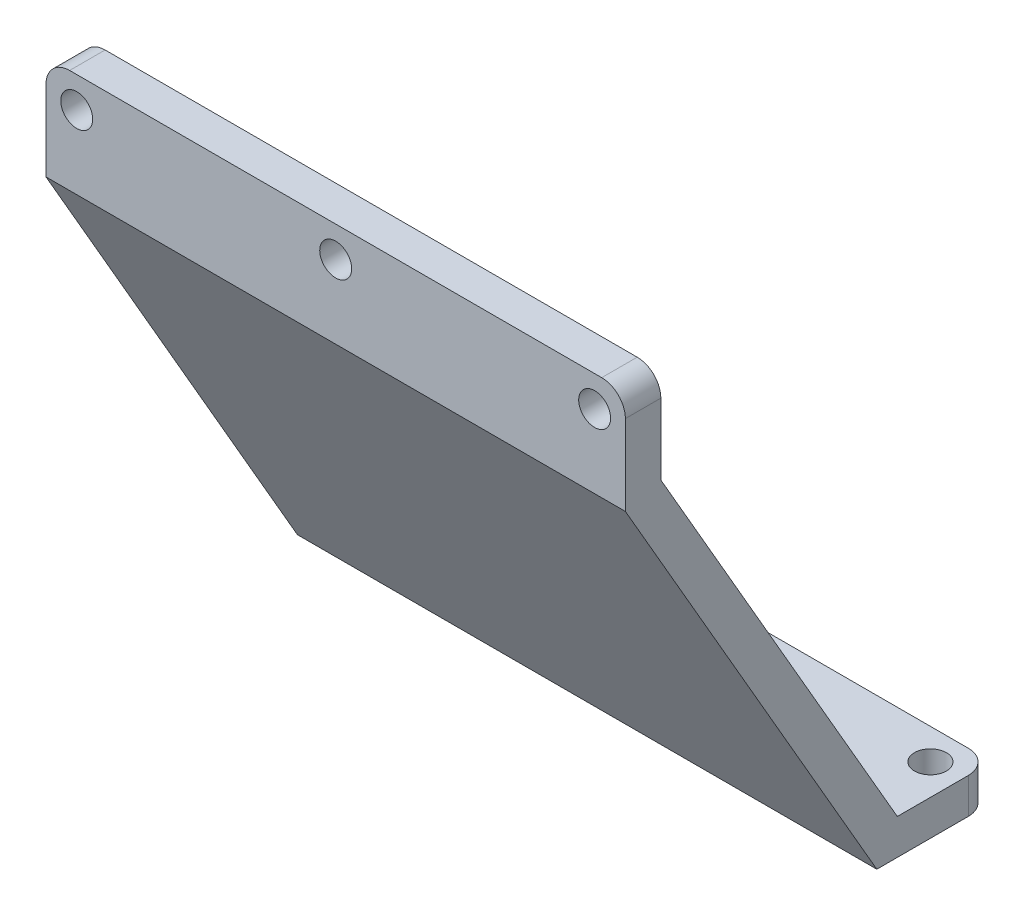
ISO-10303-21;
HEADER;
FILE_DESCRIPTION(('STEP AP214'),'2;1');
FILE_NAME('part.step','',(''),(''),'','','');
FILE_SCHEMA(('AUTOMOTIVE_DESIGN { 1 0 10303 214 1 1 1 1 }'));
ENDSEC;
DATA;
#1=APPLICATION_CONTEXT('core data for automotive mechanical design processes');
#2=APPLICATION_PROTOCOL_DEFINITION('international standard','automotive_design',2000,#1);
#3=PRODUCT_CONTEXT('',#1,'mechanical');
#4=PRODUCT('Part','Part','',(#3));
#5=PRODUCT_RELATED_PRODUCT_CATEGORY('part','',(#4));
#6=PRODUCT_DEFINITION_FORMATION('','',#4);
#7=PRODUCT_DEFINITION_CONTEXT('part definition',#1,'design');
#8=PRODUCT_DEFINITION('design','',#6,#7);
#9=PRODUCT_DEFINITION_SHAPE('','',#8);
#10=(LENGTH_UNIT() NAMED_UNIT(*) SI_UNIT(.MILLI.,.METRE.));
#11=(NAMED_UNIT(*) PLANE_ANGLE_UNIT() SI_UNIT($,.RADIAN.));
#12=(NAMED_UNIT(*) SI_UNIT($,.STERADIAN.) SOLID_ANGLE_UNIT());
#13=UNCERTAINTY_MEASURE_WITH_UNIT(LENGTH_MEASURE(1.E-05),#10,'distance_accuracy_value','');
#14=(GEOMETRIC_REPRESENTATION_CONTEXT(3) GLOBAL_UNCERTAINTY_ASSIGNED_CONTEXT((#13)) GLOBAL_UNIT_ASSIGNED_CONTEXT((#10,
#11,#12)) REPRESENTATION_CONTEXT('',''));
#15=CARTESIAN_POINT('',(0.,0.,0.));
#16=DIRECTION('',(0.,0.,1.));
#17=DIRECTION('',(1.,0.,0.));
#18=AXIS2_PLACEMENT_3D('',#15,#16,#17);
#19=CARTESIAN_POINT('',(24.5,22.82,31.));
#20=DIRECTION('',(-1.,0.,0.));
#21=DIRECTION('',(0.,-1.,0.));
#22=AXIS2_PLACEMENT_3D('',#19,#20,#21);
#23=PLANE('',#22);
#24=DIRECTION('',(0.,1.,0.));
#25=VECTOR('',#24,1.);
#26=CARTESIAN_POINT('',(24.5,22.82,28.));
#27=LINE('',#26,#25);
#28=CARTESIAN_POINT('',(24.5,14.82,28.));
#29=VERTEX_POINT('',#28);
#30=CARTESIAN_POINT('',(24.5,20.82,28.));
#31=VERTEX_POINT('',#30);
#32=EDGE_CURVE('E153',#29,#31,#27,.T.);
#33=ORIENTED_EDGE('',*,*,#32,.T.);
#34=DIRECTION('',(0.,0.,-1.));
#35=VECTOR('',#34,1.);
#36=CARTESIAN_POINT('',(24.5,20.82,31.));
#37=LINE('',#36,#35);
#38=CARTESIAN_POINT('',(24.5,20.82,31.));
#39=VERTEX_POINT('',#38);
#40=EDGE_CURVE('E228',#31,#39,#37,.F.);
#41=ORIENTED_EDGE('',*,*,#40,.T.);
#42=DIRECTION('',(0.,1.,0.));
#43=VECTOR('',#42,1.);
#44=CARTESIAN_POINT('',(24.5,22.82,31.));
#45=LINE('',#44,#43);
#46=CARTESIAN_POINT('',(24.5,14.0222501084992,31.));
#47=VERTEX_POINT('',#46);
#48=EDGE_CURVE('E192',#47,#39,#45,.T.);
#49=ORIENTED_EDGE('',*,*,#48,.F.);
#50=DIRECTION('',(0.,-0.866061356570267,-0.499937722777216));
#51=VECTOR('',#50,1.);
#52=CARTESIAN_POINT('',(24.5,-22.82,9.73264927305721));
#53=LINE('',#52,#51);
#54=CARTESIAN_POINT('',(24.5,-22.82,9.73264927305721));
#55=VERTEX_POINT('',#54);
#56=EDGE_CURVE('E177',#47,#55,#53,.T.);
#57=ORIENTED_EDGE('',*,*,#56,.T.);
#58=DIRECTION('',(0.,0.,-1.));
#59=VECTOR('',#58,1.);
#60=CARTESIAN_POINT('',(24.5,-22.82,31.));
#61=LINE('',#60,#59);
#62=CARTESIAN_POINT('',(24.5,-22.82,2.));
#63=VERTEX_POINT('',#62);
#64=EDGE_CURVE('E203',#55,#63,#61,.T.);
#65=ORIENTED_EDGE('',*,*,#64,.T.);
#66=DIRECTION('',(0.,1.,0.));
#67=VECTOR('',#66,1.);
#68=CARTESIAN_POINT('',(24.5,22.82,2.));
#69=LINE('',#68,#67);
#70=CARTESIAN_POINT('',(24.5,-19.82,2.));
#71=VERTEX_POINT('',#70);
#72=EDGE_CURVE('E134',#63,#71,#69,.T.);
#73=ORIENTED_EDGE('',*,*,#72,.T.);
#74=DIRECTION('',(0.,0.,1.));
#75=VECTOR('',#74,1.);
#76=CARTESIAN_POINT('',(24.5,-19.82,0.));
#77=LINE('',#76,#75);
#78=CARTESIAN_POINT('',(24.5,-19.82,8.));
#79=VERTEX_POINT('',#78);
#80=EDGE_CURVE('E127',#71,#79,#77,.T.);
#81=ORIENTED_EDGE('',*,*,#80,.T.);
#82=DIRECTION('',(0.,0.866019052628739,0.500011000363013));
#83=VECTOR('',#82,1.);
#84=CARTESIAN_POINT('',(24.5,-19.82,8.));
#85=LINE('',#84,#83);
#86=EDGE_CURVE('E131',#79,#29,#85,.T.);
#87=ORIENTED_EDGE('',*,*,#86,.T.);
#88=EDGE_LOOP('',(#33,#41,#49,#57,#65,#73,#81,#87));
#89=FACE_BOUND('',#88,.T.);
#90=ADVANCED_FACE('F38',(#89),#23,.F.);
#91=CARTESIAN_POINT('',(-24.5,22.82,31.));
#92=DIRECTION('',(0.,-1.,0.));
#93=DIRECTION('',(0.,0.,-1.));
#94=AXIS2_PLACEMENT_3D('',#91,#92,#93);
#95=PLANE('',#94);
#96=DIRECTION('',(-1.,0.,0.));
#97=VECTOR('',#96,1.);
#98=CARTESIAN_POINT('',(-24.5,22.82,31.));
#99=LINE('',#98,#97);
#100=CARTESIAN_POINT('',(22.5,22.82,31.));
#101=VERTEX_POINT('',#100);
#102=CARTESIAN_POINT('',(-22.5,22.82,31.));
#103=VERTEX_POINT('',#102);
#104=EDGE_CURVE('E196',#101,#103,#99,.T.);
#105=ORIENTED_EDGE('',*,*,#104,.F.);
#106=DIRECTION('',(0.,0.,-1.));
#107=VECTOR('',#106,1.);
#108=CARTESIAN_POINT('',(22.5,22.82,31.));
#109=LINE('',#108,#107);
#110=CARTESIAN_POINT('',(22.5,22.82,28.));
#111=VERTEX_POINT('',#110);
#112=EDGE_CURVE('E216',#101,#111,#109,.T.);
#113=ORIENTED_EDGE('',*,*,#112,.T.);
#114=DIRECTION('',(-1.,0.,0.));
#115=VECTOR('',#114,1.);
#116=CARTESIAN_POINT('',(24.5,22.82,28.));
#117=LINE('',#116,#115);
#118=CARTESIAN_POINT('',(-22.5,22.82,28.));
#119=VERTEX_POINT('',#118);
#120=EDGE_CURVE('E168',#111,#119,#117,.T.);
#121=ORIENTED_EDGE('',*,*,#120,.T.);
#122=DIRECTION('',(0.,0.,-1.));
#123=VECTOR('',#122,1.);
#124=CARTESIAN_POINT('',(-22.5,22.82,31.));
#125=LINE('',#124,#123);
#126=EDGE_CURVE('E213',#119,#103,#125,.F.);
#127=ORIENTED_EDGE('',*,*,#126,.T.);
#128=EDGE_LOOP('',(#105,#113,#121,#127));
#129=FACE_BOUND('',#128,.T.);
#130=ADVANCED_FACE('F271',(#129),#95,.F.);
#131=CARTESIAN_POINT('',(-24.5,22.82,31.));
#132=DIRECTION('',(1.,0.,0.));
#133=DIRECTION('',(0.,1.,0.));
#134=AXIS2_PLACEMENT_3D('',#131,#132,#133);
#135=PLANE('',#134);
#136=DIRECTION('',(0.,-1.,0.));
#137=VECTOR('',#136,1.);
#138=CARTESIAN_POINT('',(-24.5,22.82,31.));
#139=LINE('',#138,#137);
#140=CARTESIAN_POINT('',(-24.5,20.82,31.));
#141=VERTEX_POINT('',#140);
#142=CARTESIAN_POINT('',(-24.5,14.0222501084992,31.));
#143=VERTEX_POINT('',#142);
#144=EDGE_CURVE('E200',#141,#143,#139,.T.);
#145=ORIENTED_EDGE('',*,*,#144,.F.);
#146=DIRECTION('',(0.,0.,-1.));
#147=VECTOR('',#146,1.);
#148=CARTESIAN_POINT('',(-24.5,20.82,31.));
#149=LINE('',#148,#147);
#150=CARTESIAN_POINT('',(-24.5,20.82,28.));
#151=VERTEX_POINT('',#150);
#152=EDGE_CURVE('E241',#141,#151,#149,.T.);
#153=ORIENTED_EDGE('',*,*,#152,.T.);
#154=DIRECTION('',(0.,1.,0.));
#155=VECTOR('',#154,1.);
#156=CARTESIAN_POINT('',(-24.5,22.82,28.));
#157=LINE('',#156,#155);
#158=CARTESIAN_POINT('',(-24.5,14.82,28.));
#159=VERTEX_POINT('',#158);
#160=EDGE_CURVE('E136',#159,#151,#157,.T.);
#161=ORIENTED_EDGE('',*,*,#160,.F.);
#162=DIRECTION('',(0.,0.866019052628739,0.500011000363013));
#163=VECTOR('',#162,1.);
#164=CARTESIAN_POINT('',(-24.5,-19.82,8.));
#165=LINE('',#164,#163);
#166=CARTESIAN_POINT('',(-24.5,-19.82,8.));
#167=VERTEX_POINT('',#166);
#168=EDGE_CURVE('E161',#167,#159,#165,.T.);
#169=ORIENTED_EDGE('',*,*,#168,.F.);
#170=DIRECTION('',(0.,0.,1.));
#171=VECTOR('',#170,1.);
#172=CARTESIAN_POINT('',(-24.5,-19.82,0.));
#173=LINE('',#172,#171);
#174=CARTESIAN_POINT('',(-24.5,-19.82,2.));
#175=VERTEX_POINT('',#174);
#176=EDGE_CURVE('E142',#175,#167,#173,.T.);
#177=ORIENTED_EDGE('',*,*,#176,.F.);
#178=DIRECTION('',(0.,-1.,0.));
#179=VECTOR('',#178,1.);
#180=CARTESIAN_POINT('',(-24.5,22.82,2.));
#181=LINE('',#180,#179);
#182=CARTESIAN_POINT('',(-24.5,-22.82,2.));
#183=VERTEX_POINT('',#182);
#184=EDGE_CURVE('E237',#175,#183,#181,.T.);
#185=ORIENTED_EDGE('',*,*,#184,.T.);
#186=DIRECTION('',(0.,0.,-1.));
#187=VECTOR('',#186,1.);
#188=CARTESIAN_POINT('',(-24.5,-22.82,31.));
#189=LINE('',#188,#187);
#190=CARTESIAN_POINT('',(-24.5,-22.82,9.73264927305721));
#191=VERTEX_POINT('',#190);
#192=EDGE_CURVE('E209',#191,#183,#189,.T.);
#193=ORIENTED_EDGE('',*,*,#192,.F.);
#194=DIRECTION('',(0.,-0.866061356570267,-0.499937722777216));
#195=VECTOR('',#194,1.);
#196=CARTESIAN_POINT('',(-24.5,-22.82,9.73264927305721));
#197=LINE('',#196,#195);
#198=EDGE_CURVE('E172',#143,#191,#197,.T.);
#199=ORIENTED_EDGE('',*,*,#198,.F.);
#200=EDGE_LOOP('',(#145,#153,#161,#169,#177,#185,#193,#199));
#201=FACE_BOUND('',#200,.T.);
#202=ADVANCED_FACE('F277',(#201),#135,.F.);
#203=CARTESIAN_POINT('',(-24.5,-22.82,31.));
#204=DIRECTION('',(0.,1.,0.));
#205=DIRECTION('',(0.,0.,1.));
#206=AXIS2_PLACEMENT_3D('',#203,#204,#205);
#207=PLANE('',#206);
#208=CARTESIAN_POINT('',(21.9,-22.82,2.6));
#209=DIRECTION('',(0.,1.,0.));
#210=DIRECTION('',(-1.,0.,0.));
#211=AXIS2_PLACEMENT_3D('',#208,#209,#210);
#212=CIRCLE('',#211,1.35);
#213=CARTESIAN_POINT('',(20.55,-22.82,2.6));
#214=VERTEX_POINT('',#213);
#215=EDGE_CURVE('E162',#214,#214,#212,.T.);
#216=ORIENTED_EDGE('',*,*,#215,.T.);
#217=EDGE_LOOP('',(#216));
#218=FACE_BOUND('',#217,.T.);
#219=CARTESIAN_POINT('',(0.,-22.82,2.6));
#220=DIRECTION('',(0.,1.,0.));
#221=DIRECTION('',(-1.,0.,0.));
#222=AXIS2_PLACEMENT_3D('',#219,#220,#221);
#223=CIRCLE('',#222,1.35);
#224=CARTESIAN_POINT('',(-1.35,-22.82,2.6));
#225=VERTEX_POINT('',#224);
#226=EDGE_CURVE('E488',#225,#225,#223,.T.);
#227=ORIENTED_EDGE('',*,*,#226,.T.);
#228=EDGE_LOOP('',(#227));
#229=FACE_BOUND('',#228,.T.);
#230=CARTESIAN_POINT('',(-21.9,-22.82,2.6));
#231=DIRECTION('',(0.,1.,0.));
#232=DIRECTION('',(-1.,0.,0.));
#233=AXIS2_PLACEMENT_3D('',#230,#231,#232);
#234=CIRCLE('',#233,1.35);
#235=CARTESIAN_POINT('',(-23.25,-22.82,2.6));
#236=VERTEX_POINT('',#235);
#237=EDGE_CURVE('E496',#236,#236,#234,.T.);
#238=ORIENTED_EDGE('',*,*,#237,.T.);
#239=EDGE_LOOP('',(#238));
#240=FACE_BOUND('',#239,.T.);
#241=ORIENTED_EDGE('',*,*,#192,.T.);
#242=CARTESIAN_POINT('',(-22.5,-22.82,2.));
#243=DIRECTION('',(0.,1.,0.));
#244=DIRECTION('',(0.,0.,1.));
#245=AXIS2_PLACEMENT_3D('',#242,#243,#244);
#246=CIRCLE('',#245,2.);
#247=CARTESIAN_POINT('',(-22.5,-22.82,0.));
#248=VERTEX_POINT('',#247);
#249=EDGE_CURVE('E248',#183,#248,#246,.F.);
#250=ORIENTED_EDGE('',*,*,#249,.T.);
#251=DIRECTION('',(1.,0.,0.));
#252=VECTOR('',#251,1.);
#253=CARTESIAN_POINT('',(-24.5,-22.82,0.));
#254=LINE('',#253,#252);
#255=CARTESIAN_POINT('',(22.5,-22.82,0.));
#256=VERTEX_POINT('',#255);
#257=EDGE_CURVE('E188',#248,#256,#254,.T.);
#258=ORIENTED_EDGE('',*,*,#257,.T.);
#259=CARTESIAN_POINT('',(22.5,-22.82,2.));
#260=DIRECTION('',(0.,1.,0.));
#261=DIRECTION('',(0.,0.,1.));
#262=AXIS2_PLACEMENT_3D('',#259,#260,#261);
#263=CIRCLE('',#262,2.);
#264=EDGE_CURVE('E245',#256,#63,#263,.F.);
#265=ORIENTED_EDGE('',*,*,#264,.T.);
#266=ORIENTED_EDGE('',*,*,#64,.F.);
#267=DIRECTION('',(-1.,0.,0.));
#268=VECTOR('',#267,1.);
#269=CARTESIAN_POINT('',(24.5,-22.82,9.73264927305721));
#270=LINE('',#269,#268);
#271=EDGE_CURVE('E184',#55,#191,#270,.T.);
#272=ORIENTED_EDGE('',*,*,#271,.T.);
#273=EDGE_LOOP('',(#241,#250,#258,#265,#266,#272));
#274=FACE_BOUND('',#273,.T.);
#275=ADVANCED_FACE('F261',(#218,#229,#240,#274),#207,.F.);
#276=CARTESIAN_POINT('',(0.,0.,31.));
#277=DIRECTION('',(0.,0.,1.));
#278=DIRECTION('',(1.,0.,0.));
#279=AXIS2_PLACEMENT_3D('',#276,#277,#278);
#280=PLANE('',#279);
#281=CARTESIAN_POINT('',(-21.9,20.22,31.));
#282=DIRECTION('',(0.,0.,-1.));
#283=DIRECTION('',(-1.,0.,0.));
#284=AXIS2_PLACEMENT_3D('',#281,#282,#283);
#285=CIRCLE('',#284,1.35);
#286=CARTESIAN_POINT('',(-23.25,20.22,31.));
#287=VERTEX_POINT('',#286);
#288=EDGE_CURVE('E456',#287,#287,#285,.T.);
#289=ORIENTED_EDGE('',*,*,#288,.T.);
#290=EDGE_LOOP('',(#289));
#291=FACE_BOUND('',#290,.T.);
#292=CARTESIAN_POINT('',(0.,20.22,31.));
#293=DIRECTION('',(0.,0.,-1.));
#294=DIRECTION('',(-1.,0.,0.));
#295=AXIS2_PLACEMENT_3D('',#292,#293,#294);
#296=CIRCLE('',#295,1.35);
#297=CARTESIAN_POINT('',(-1.35000000000001,20.22,31.));
#298=VERTEX_POINT('',#297);
#299=EDGE_CURVE('E460',#298,#298,#296,.T.);
#300=ORIENTED_EDGE('',*,*,#299,.T.);
#301=EDGE_LOOP('',(#300));
#302=FACE_BOUND('',#301,.T.);
#303=CARTESIAN_POINT('',(21.9,20.22,31.));
#304=DIRECTION('',(0.,0.,-1.));
#305=DIRECTION('',(-1.,0.,0.));
#306=AXIS2_PLACEMENT_3D('',#303,#304,#305);
#307=CIRCLE('',#306,1.35);
#308=CARTESIAN_POINT('',(20.55,20.22,31.));
#309=VERTEX_POINT('',#308);
#310=EDGE_CURVE('E473',#309,#309,#307,.T.);
#311=ORIENTED_EDGE('',*,*,#310,.T.);
#312=EDGE_LOOP('',(#311));
#313=FACE_BOUND('',#312,.T.);
#314=ORIENTED_EDGE('',*,*,#48,.T.);
#315=CARTESIAN_POINT('',(22.5,20.82,31.));
#316=DIRECTION('',(0.,0.,1.));
#317=DIRECTION('',(1.,0.,0.));
#318=AXIS2_PLACEMENT_3D('',#315,#316,#317);
#319=CIRCLE('',#318,2.);
#320=EDGE_CURVE('E234',#39,#101,#319,.T.);
#321=ORIENTED_EDGE('',*,*,#320,.T.);
#322=ORIENTED_EDGE('',*,*,#104,.T.);
#323=CARTESIAN_POINT('',(-22.5,20.82,31.));
#324=DIRECTION('',(0.,0.,1.));
#325=DIRECTION('',(1.,0.,0.));
#326=AXIS2_PLACEMENT_3D('',#323,#324,#325);
#327=CIRCLE('',#326,2.);
#328=EDGE_CURVE('E231',#103,#141,#327,.T.);
#329=ORIENTED_EDGE('',*,*,#328,.T.);
#330=ORIENTED_EDGE('',*,*,#144,.T.);
#331=DIRECTION('',(-1.,0.,0.));
#332=VECTOR('',#331,1.);
#333=CARTESIAN_POINT('',(24.5,14.0222501084992,31.));
#334=LINE('',#333,#332);
#335=EDGE_CURVE('E181',#47,#143,#334,.T.);
#336=ORIENTED_EDGE('',*,*,#335,.F.);
#337=EDGE_LOOP('',(#314,#321,#322,#329,#330,#336));
#338=FACE_BOUND('',#337,.T.);
#339=ADVANCED_FACE('F296',(#291,#302,#313,#338),#280,.T.);
#340=CARTESIAN_POINT('',(0.,0.,0.));
#341=DIRECTION('',(0.,0.,1.));
#342=DIRECTION('',(1.,0.,0.));
#343=AXIS2_PLACEMENT_3D('',#340,#341,#342);
#344=PLANE('',#343);
#345=ORIENTED_EDGE('',*,*,#257,.F.);
#346=DIRECTION('',(0.,-1.,0.));
#347=VECTOR('',#346,1.);
#348=CARTESIAN_POINT('',(-22.5,0.,0.));
#349=LINE('',#348,#347);
#350=CARTESIAN_POINT('',(-22.5,-19.82,0.));
#351=VERTEX_POINT('',#350);
#352=EDGE_CURVE('E54',#248,#351,#349,.F.);
#353=ORIENTED_EDGE('',*,*,#352,.T.);
#354=DIRECTION('',(-1.,0.,0.));
#355=VECTOR('',#354,1.);
#356=CARTESIAN_POINT('',(24.5,-19.82,0.));
#357=LINE('',#356,#355);
#358=CARTESIAN_POINT('',(22.5,-19.82,0.));
#359=VERTEX_POINT('',#358);
#360=EDGE_CURVE('E148',#359,#351,#357,.T.);
#361=ORIENTED_EDGE('',*,*,#360,.F.);
#362=DIRECTION('',(0.,1.,0.));
#363=VECTOR('',#362,1.);
#364=CARTESIAN_POINT('',(22.5,0.,0.));
#365=LINE('',#364,#363);
#366=EDGE_CURVE('E251',#359,#256,#365,.F.);
#367=ORIENTED_EDGE('',*,*,#366,.T.);
#368=EDGE_LOOP('',(#345,#353,#361,#367));
#369=FACE_BOUND('',#368,.T.);
#370=ADVANCED_FACE('F257',(#369),#344,.F.);
#371=CARTESIAN_POINT('',(24.5,-22.82,9.73264927305721));
#372=DIRECTION('',(0.,0.499937722777216,-0.866061356570267));
#373=DIRECTION('',(0.,0.866061356570267,0.499937722777216));
#374=AXIS2_PLACEMENT_3D('',#371,#372,#373);
#375=PLANE('',#374);
#376=ORIENTED_EDGE('',*,*,#198,.T.);
#377=ORIENTED_EDGE('',*,*,#271,.F.);
#378=ORIENTED_EDGE('',*,*,#56,.F.);
#379=ORIENTED_EDGE('',*,*,#335,.T.);
#380=EDGE_LOOP('',(#376,#377,#378,#379));
#381=FACE_BOUND('',#380,.T.);
#382=ADVANCED_FACE('F304',(#381),#375,.F.);
#383=CARTESIAN_POINT('',(24.5,22.82,28.));
#384=DIRECTION('',(0.,0.,1.));
#385=DIRECTION('',(1.,0.,0.));
#386=AXIS2_PLACEMENT_3D('',#383,#384,#385);
#387=PLANE('',#386);
#388=CARTESIAN_POINT('',(-21.9,20.22,28.));
#389=DIRECTION('',(0.,0.,-1.));
#390=DIRECTION('',(-1.,0.,0.));
#391=AXIS2_PLACEMENT_3D('',#388,#389,#390);
#392=CIRCLE('',#391,1.35);
#393=CARTESIAN_POINT('',(-23.25,20.22,28.));
#394=VERTEX_POINT('',#393);
#395=EDGE_CURVE('E458',#394,#394,#392,.T.);
#396=ORIENTED_EDGE('',*,*,#395,.F.);
#397=EDGE_LOOP('',(#396));
#398=FACE_BOUND('',#397,.T.);
#399=CARTESIAN_POINT('',(0.,20.22,28.));
#400=DIRECTION('',(0.,0.,-1.));
#401=DIRECTION('',(-1.,0.,0.));
#402=AXIS2_PLACEMENT_3D('',#399,#400,#401);
#403=CIRCLE('',#402,1.35);
#404=CARTESIAN_POINT('',(-1.35000000000001,20.22,28.));
#405=VERTEX_POINT('',#404);
#406=EDGE_CURVE('E467',#405,#405,#403,.T.);
#407=ORIENTED_EDGE('',*,*,#406,.F.);
#408=EDGE_LOOP('',(#407));
#409=FACE_BOUND('',#408,.T.);
#410=CARTESIAN_POINT('',(21.9,20.22,28.));
#411=DIRECTION('',(0.,0.,-1.));
#412=DIRECTION('',(-1.,0.,0.));
#413=AXIS2_PLACEMENT_3D('',#410,#411,#412);
#414=CIRCLE('',#413,1.35);
#415=CARTESIAN_POINT('',(20.55,20.22,28.));
#416=VERTEX_POINT('',#415);
#417=EDGE_CURVE('E477',#416,#416,#414,.T.);
#418=ORIENTED_EDGE('',*,*,#417,.F.);
#419=EDGE_LOOP('',(#418));
#420=FACE_BOUND('',#419,.T.);
#421=ORIENTED_EDGE('',*,*,#120,.F.);
#422=CARTESIAN_POINT('',(22.5,20.82,28.));
#423=DIRECTION('',(0.,0.,1.));
#424=DIRECTION('',(1.,0.,0.));
#425=AXIS2_PLACEMENT_3D('',#422,#423,#424);
#426=CIRCLE('',#425,2.);
#427=EDGE_CURVE('E223',#111,#31,#426,.F.);
#428=ORIENTED_EDGE('',*,*,#427,.T.);
#429=ORIENTED_EDGE('',*,*,#32,.F.);
#430=DIRECTION('',(-1.,0.,0.));
#431=VECTOR('',#430,1.);
#432=CARTESIAN_POINT('',(24.5,14.82,28.));
#433=LINE('',#432,#431);
#434=EDGE_CURVE('E147',#29,#159,#433,.T.);
#435=ORIENTED_EDGE('',*,*,#434,.T.);
#436=ORIENTED_EDGE('',*,*,#160,.T.);
#437=CARTESIAN_POINT('',(-22.5,20.82,28.));
#438=DIRECTION('',(0.,0.,1.));
#439=DIRECTION('',(1.,0.,0.));
#440=AXIS2_PLACEMENT_3D('',#437,#438,#439);
#441=CIRCLE('',#440,2.);
#442=EDGE_CURVE('E220',#151,#119,#441,.F.);
#443=ORIENTED_EDGE('',*,*,#442,.T.);
#444=EDGE_LOOP('',(#421,#428,#429,#435,#436,#443));
#445=FACE_BOUND('',#444,.T.);
#446=ADVANCED_FACE('F311',(#398,#409,#420,#445),#387,.F.);
#447=CARTESIAN_POINT('',(24.5,-19.82,8.));
#448=DIRECTION('',(0.,-0.500011000363013,0.866019052628739));
#449=DIRECTION('',(0.,-0.866019052628739,-0.500011000363013));
#450=AXIS2_PLACEMENT_3D('',#447,#448,#449);
#451=PLANE('',#450);
#452=ORIENTED_EDGE('',*,*,#168,.T.);
#453=ORIENTED_EDGE('',*,*,#434,.F.);
#454=ORIENTED_EDGE('',*,*,#86,.F.);
#455=DIRECTION('',(-1.,0.,0.));
#456=VECTOR('',#455,1.);
#457=CARTESIAN_POINT('',(24.5,-19.82,8.));
#458=LINE('',#457,#456);
#459=EDGE_CURVE('E139',#79,#167,#458,.T.);
#460=ORIENTED_EDGE('',*,*,#459,.T.);
#461=EDGE_LOOP('',(#452,#453,#454,#460));
#462=FACE_BOUND('',#461,.T.);
#463=ADVANCED_FACE('F150',(#462),#451,.F.);
#464=CARTESIAN_POINT('',(24.5,-19.82,0.));
#465=DIRECTION('',(0.,-1.,0.));
#466=DIRECTION('',(1.,0.,0.));
#467=AXIS2_PLACEMENT_3D('',#464,#465,#466);
#468=PLANE('',#467);
#469=CARTESIAN_POINT('',(21.9,-19.82,2.6));
#470=DIRECTION('',(0.,1.,0.));
#471=DIRECTION('',(-1.,0.,0.));
#472=AXIS2_PLACEMENT_3D('',#469,#470,#471);
#473=CIRCLE('',#472,1.35);
#474=CARTESIAN_POINT('',(20.55,-19.82,2.6));
#475=VERTEX_POINT('',#474);
#476=EDGE_CURVE('E484',#475,#475,#473,.T.);
#477=ORIENTED_EDGE('',*,*,#476,.F.);
#478=EDGE_LOOP('',(#477));
#479=FACE_BOUND('',#478,.T.);
#480=CARTESIAN_POINT('',(0.,-19.82,2.6));
#481=DIRECTION('',(0.,1.,0.));
#482=DIRECTION('',(-1.,0.,0.));
#483=AXIS2_PLACEMENT_3D('',#480,#481,#482);
#484=CIRCLE('',#483,1.35);
#485=CARTESIAN_POINT('',(-1.35,-19.82,2.6));
#486=VERTEX_POINT('',#485);
#487=EDGE_CURVE('E492',#486,#486,#484,.T.);
#488=ORIENTED_EDGE('',*,*,#487,.F.);
#489=EDGE_LOOP('',(#488));
#490=FACE_BOUND('',#489,.T.);
#491=CARTESIAN_POINT('',(-21.9,-19.82,2.6));
#492=DIRECTION('',(0.,1.,0.));
#493=DIRECTION('',(-1.,0.,0.));
#494=AXIS2_PLACEMENT_3D('',#491,#492,#493);
#495=CIRCLE('',#494,1.35);
#496=CARTESIAN_POINT('',(-23.25,-19.82,2.6));
#497=VERTEX_POINT('',#496);
#498=EDGE_CURVE('E464',#497,#497,#495,.T.);
#499=ORIENTED_EDGE('',*,*,#498,.F.);
#500=EDGE_LOOP('',(#499));
#501=FACE_BOUND('',#500,.T.);
#502=ORIENTED_EDGE('',*,*,#360,.T.);
#503=CARTESIAN_POINT('',(-22.5,-19.82,2.));
#504=DIRECTION('',(0.,-1.,0.));
#505=DIRECTION('',(1.,0.,0.));
#506=AXIS2_PLACEMENT_3D('',#503,#504,#505);
#507=CIRCLE('',#506,2.);
#508=EDGE_CURVE('E11',#351,#175,#507,.F.);
#509=ORIENTED_EDGE('',*,*,#508,.T.);
#510=ORIENTED_EDGE('',*,*,#176,.T.);
#511=ORIENTED_EDGE('',*,*,#459,.F.);
#512=ORIENTED_EDGE('',*,*,#80,.F.);
#513=CARTESIAN_POINT('',(22.5,-19.82,2.));
#514=DIRECTION('',(0.,-1.,0.));
#515=DIRECTION('',(1.,0.,0.));
#516=AXIS2_PLACEMENT_3D('',#513,#514,#515);
#517=CIRCLE('',#516,2.);
#518=EDGE_CURVE('E47',#71,#359,#517,.F.);
#519=ORIENTED_EDGE('',*,*,#518,.T.);
#520=EDGE_LOOP('',(#502,#509,#510,#511,#512,#519));
#521=FACE_BOUND('',#520,.T.);
#522=ADVANCED_FACE('F140',(#479,#490,#501,#521),#468,.F.);
#523=CARTESIAN_POINT('',(-21.9,-22.82,2.6));
#524=DIRECTION('',(0.,1.,0.));
#525=DIRECTION('',(-1.,0.,0.));
#526=AXIS2_PLACEMENT_3D('',#523,#524,#525);
#527=CYLINDRICAL_SURFACE('',#526,1.35);
#528=CARTESIAN_POINT('',(-23.25,-22.82,2.6));
#529=CARTESIAN_POINT('',(-23.25,-22.78875,2.6));
#530=CARTESIAN_POINT('',(-23.25,-22.7575,2.6));
#531=CARTESIAN_POINT('',(-23.25,-22.695,2.6));
#532=CARTESIAN_POINT('',(-23.25,-22.66375,2.6));
#533=CARTESIAN_POINT('',(-23.25,-22.60125,2.6));
#534=CARTESIAN_POINT('',(-23.25,-22.57,2.6));
#535=CARTESIAN_POINT('',(-23.25,-22.5075,2.6));
#536=CARTESIAN_POINT('',(-23.25,-22.47625,2.6));
#537=CARTESIAN_POINT('',(-23.25,-22.41375,2.6));
#538=CARTESIAN_POINT('',(-23.25,-22.3825,2.6));
#539=CARTESIAN_POINT('',(-23.25,-22.32,2.6));
#540=CARTESIAN_POINT('',(-23.25,-22.28875,2.6));
#541=CARTESIAN_POINT('',(-23.25,-22.22625,2.6));
#542=CARTESIAN_POINT('',(-23.25,-22.195,2.6));
#543=CARTESIAN_POINT('',(-23.25,-22.1325,2.6));
#544=CARTESIAN_POINT('',(-23.25,-22.10125,2.6));
#545=CARTESIAN_POINT('',(-23.25,-22.03875,2.6));
#546=CARTESIAN_POINT('',(-23.25,-22.0075,2.6));
#547=CARTESIAN_POINT('',(-23.25,-21.945,2.6));
#548=CARTESIAN_POINT('',(-23.25,-21.91375,2.6));
#549=CARTESIAN_POINT('',(-23.25,-21.85125,2.6));
#550=CARTESIAN_POINT('',(-23.25,-21.82,2.6));
#551=CARTESIAN_POINT('',(-23.25,-21.7575,2.6));
#552=CARTESIAN_POINT('',(-23.25,-21.72625,2.6));
#553=CARTESIAN_POINT('',(-23.25,-21.66375,2.6));
#554=CARTESIAN_POINT('',(-23.25,-21.6325,2.6));
#555=CARTESIAN_POINT('',(-23.25,-21.57,2.6));
#556=CARTESIAN_POINT('',(-23.25,-21.53875,2.6));
#557=CARTESIAN_POINT('',(-23.25,-21.47625,2.6));
#558=CARTESIAN_POINT('',(-23.25,-21.445,2.6));
#559=CARTESIAN_POINT('',(-23.25,-21.3825,2.6));
#560=CARTESIAN_POINT('',(-23.25,-21.35125,2.6));
#561=CARTESIAN_POINT('',(-23.25,-21.28875,2.6));
#562=CARTESIAN_POINT('',(-23.25,-21.2575,2.6));
#563=CARTESIAN_POINT('',(-23.25,-21.195,2.6));
#564=CARTESIAN_POINT('',(-23.25,-21.16375,2.6));
#565=CARTESIAN_POINT('',(-23.25,-21.10125,2.6));
#566=CARTESIAN_POINT('',(-23.25,-21.07,2.6));
#567=CARTESIAN_POINT('',(-23.25,-21.0075,2.6));
#568=CARTESIAN_POINT('',(-23.25,-20.97625,2.6));
#569=CARTESIAN_POINT('',(-23.25,-20.91375,2.6));
#570=CARTESIAN_POINT('',(-23.25,-20.8825,2.6));
#571=CARTESIAN_POINT('',(-23.25,-20.82,2.6));
#572=CARTESIAN_POINT('',(-23.25,-20.78875,2.6));
#573=CARTESIAN_POINT('',(-23.25,-20.72625,2.6));
#574=CARTESIAN_POINT('',(-23.25,-20.695,2.6));
#575=CARTESIAN_POINT('',(-23.25,-20.6325,2.6));
#576=CARTESIAN_POINT('',(-23.25,-20.60125,2.6));
#577=CARTESIAN_POINT('',(-23.25,-20.53875,2.6));
#578=CARTESIAN_POINT('',(-23.25,-20.5075,2.6));
#579=CARTESIAN_POINT('',(-23.25,-20.445,2.6));
#580=CARTESIAN_POINT('',(-23.25,-20.41375,2.6));
#581=CARTESIAN_POINT('',(-23.25,-20.35125,2.6));
#582=CARTESIAN_POINT('',(-23.25,-20.32,2.6));
#583=CARTESIAN_POINT('',(-23.25,-20.2575,2.6));
#584=CARTESIAN_POINT('',(-23.25,-20.22625,2.6));
#585=CARTESIAN_POINT('',(-23.25,-20.16375,2.6));
#586=CARTESIAN_POINT('',(-23.25,-20.1325,2.6));
#587=CARTESIAN_POINT('',(-23.25,-20.07,2.6));
#588=CARTESIAN_POINT('',(-23.25,-20.03875,2.6));
#589=CARTESIAN_POINT('',(-23.25,-19.97625,2.6));
#590=CARTESIAN_POINT('',(-23.25,-19.945,2.6));
#591=CARTESIAN_POINT('',(-23.25,-19.8825,2.6));
#592=CARTESIAN_POINT('',(-23.25,-19.85125,2.6));
#593=CARTESIAN_POINT('',(-23.25,-19.82,2.6));
#594=B_SPLINE_CURVE_WITH_KNOTS('',3,(#528,#529,#530,#531,#532,#533,#534,#535,#536,#537,#538,
#539,#540,#541,#542,#543,#544,#545,#546,#547,#548,#549,#550,#551,#552,#553,#554,#555,#556,#557,
#558,#559,#560,#561,#562,#563,#564,#565,#566,#567,#568,#569,#570,#571,#572,#573,#574,#575,#576,
#577,#578,#579,#580,#581,#582,#583,#584,#585,#586,#587,#588,#589,#590,#591,#592,#593),
.UNSPECIFIED.,.F.,.F.,(4,2,2,2,2,2,2,2,2,2,2,2,2,2,2,2,2,2,2,2,2,2,2,2,2,2,2,2,2,2,2,2,4),(0.,
0.0937500000000001,0.1875,0.28125,0.375,0.46875,0.5625,0.656250000000001,0.750000000000001,
0.843750000000001,0.937500000000001,1.03125,1.125,1.21875,1.3125,1.40625,1.5,1.59375,1.6875,
1.78125,1.875,1.96875,2.0625,2.15625,2.25,2.34375,2.4375,2.53125,2.625,2.71875,2.8125,2.90625,
3.),.UNSPECIFIED.);
#595=EDGE_CURVE('BSEAM328',#236,#497,#594,.T.);
#596=ORIENTED_EDGE('',*,*,#237,.F.);
#597=ORIENTED_EDGE('',*,*,#498,.T.);
#598=ORIENTED_EDGE('',*,*,#595,.T.);
#599=ORIENTED_EDGE('',*,*,#595,.F.);
#600=EDGE_LOOP('',(#596,#598,#597,#599));
#601=FACE_BOUND('',#600,.T.);
#602=ADVANCED_FACE('F328',(#601),#527,.F.);
#603=CARTESIAN_POINT('',(0.,-22.82,2.6));
#604=DIRECTION('',(0.,1.,0.));
#605=DIRECTION('',(-1.,0.,0.));
#606=AXIS2_PLACEMENT_3D('',#603,#604,#605);
#607=CYLINDRICAL_SURFACE('',#606,1.35);
#608=CARTESIAN_POINT('',(-1.35,-22.82,2.6));
#609=CARTESIAN_POINT('',(-1.35,-22.78875,2.6));
#610=CARTESIAN_POINT('',(-1.35,-22.7575,2.6));
#611=CARTESIAN_POINT('',(-1.35,-22.695,2.6));
#612=CARTESIAN_POINT('',(-1.35,-22.66375,2.6));
#613=CARTESIAN_POINT('',(-1.35,-22.60125,2.6));
#614=CARTESIAN_POINT('',(-1.35,-22.57,2.6));
#615=CARTESIAN_POINT('',(-1.35,-22.5075,2.6));
#616=CARTESIAN_POINT('',(-1.35,-22.47625,2.6));
#617=CARTESIAN_POINT('',(-1.35,-22.41375,2.6));
#618=CARTESIAN_POINT('',(-1.35,-22.3825,2.6));
#619=CARTESIAN_POINT('',(-1.35,-22.32,2.6));
#620=CARTESIAN_POINT('',(-1.35,-22.28875,2.6));
#621=CARTESIAN_POINT('',(-1.35,-22.22625,2.6));
#622=CARTESIAN_POINT('',(-1.35,-22.195,2.6));
#623=CARTESIAN_POINT('',(-1.35,-22.1325,2.6));
#624=CARTESIAN_POINT('',(-1.35,-22.10125,2.6));
#625=CARTESIAN_POINT('',(-1.35,-22.03875,2.6));
#626=CARTESIAN_POINT('',(-1.35,-22.0075,2.6));
#627=CARTESIAN_POINT('',(-1.35,-21.945,2.6));
#628=CARTESIAN_POINT('',(-1.35,-21.91375,2.6));
#629=CARTESIAN_POINT('',(-1.35,-21.85125,2.6));
#630=CARTESIAN_POINT('',(-1.35,-21.82,2.6));
#631=CARTESIAN_POINT('',(-1.35,-21.7575,2.6));
#632=CARTESIAN_POINT('',(-1.35,-21.72625,2.6));
#633=CARTESIAN_POINT('',(-1.35,-21.66375,2.6));
#634=CARTESIAN_POINT('',(-1.35,-21.6325,2.6));
#635=CARTESIAN_POINT('',(-1.35,-21.57,2.6));
#636=CARTESIAN_POINT('',(-1.35,-21.53875,2.6));
#637=CARTESIAN_POINT('',(-1.35,-21.47625,2.6));
#638=CARTESIAN_POINT('',(-1.35,-21.445,2.6));
#639=CARTESIAN_POINT('',(-1.35,-21.3825,2.6));
#640=CARTESIAN_POINT('',(-1.35,-21.35125,2.6));
#641=CARTESIAN_POINT('',(-1.35,-21.28875,2.6));
#642=CARTESIAN_POINT('',(-1.35,-21.2575,2.6));
#643=CARTESIAN_POINT('',(-1.35,-21.195,2.6));
#644=CARTESIAN_POINT('',(-1.35,-21.16375,2.6));
#645=CARTESIAN_POINT('',(-1.35,-21.10125,2.6));
#646=CARTESIAN_POINT('',(-1.35,-21.07,2.6));
#647=CARTESIAN_POINT('',(-1.35,-21.0075,2.6));
#648=CARTESIAN_POINT('',(-1.35,-20.97625,2.6));
#649=CARTESIAN_POINT('',(-1.35,-20.91375,2.6));
#650=CARTESIAN_POINT('',(-1.35,-20.8825,2.6));
#651=CARTESIAN_POINT('',(-1.35,-20.82,2.6));
#652=CARTESIAN_POINT('',(-1.35,-20.78875,2.6));
#653=CARTESIAN_POINT('',(-1.35,-20.72625,2.6));
#654=CARTESIAN_POINT('',(-1.35,-20.695,2.6));
#655=CARTESIAN_POINT('',(-1.35,-20.6325,2.6));
#656=CARTESIAN_POINT('',(-1.35,-20.60125,2.6));
#657=CARTESIAN_POINT('',(-1.35,-20.53875,2.6));
#658=CARTESIAN_POINT('',(-1.35,-20.5075,2.6));
#659=CARTESIAN_POINT('',(-1.35,-20.445,2.6));
#660=CARTESIAN_POINT('',(-1.35,-20.41375,2.6));
#661=CARTESIAN_POINT('',(-1.35,-20.35125,2.6));
#662=CARTESIAN_POINT('',(-1.35,-20.32,2.6));
#663=CARTESIAN_POINT('',(-1.35,-20.2575,2.6));
#664=CARTESIAN_POINT('',(-1.35,-20.22625,2.6));
#665=CARTESIAN_POINT('',(-1.35,-20.16375,2.6));
#666=CARTESIAN_POINT('',(-1.35,-20.1325,2.6));
#667=CARTESIAN_POINT('',(-1.35,-20.07,2.6));
#668=CARTESIAN_POINT('',(-1.35,-20.03875,2.6));
#669=CARTESIAN_POINT('',(-1.35,-19.97625,2.6));
#670=CARTESIAN_POINT('',(-1.35,-19.945,2.6));
#671=CARTESIAN_POINT('',(-1.35,-19.8825,2.6));
#672=CARTESIAN_POINT('',(-1.35,-19.85125,2.6));
#673=CARTESIAN_POINT('',(-1.35,-19.82,2.6));
#674=B_SPLINE_CURVE_WITH_KNOTS('',3,(#608,#609,#610,#611,#612,#613,#614,#615,#616,#617,#618,
#619,#620,#621,#622,#623,#624,#625,#626,#627,#628,#629,#630,#631,#632,#633,#634,#635,#636,#637,
#638,#639,#640,#641,#642,#643,#644,#645,#646,#647,#648,#649,#650,#651,#652,#653,#654,#655,#656,
#657,#658,#659,#660,#661,#662,#663,#664,#665,#666,#667,#668,#669,#670,#671,#672,#673),
.UNSPECIFIED.,.F.,.F.,(4,2,2,2,2,2,2,2,2,2,2,2,2,2,2,2,2,2,2,2,2,2,2,2,2,2,2,2,2,2,2,2,4),(0.,
0.0937500000000001,0.1875,0.28125,0.375,0.46875,0.5625,0.656250000000001,0.750000000000001,
0.843750000000001,0.937500000000001,1.03125,1.125,1.21875,1.3125,1.40625,1.5,1.59375,1.6875,
1.78125,1.875,1.96875,2.0625,2.15625,2.25,2.34375,2.4375,2.53125,2.625,2.71875000000001,2.8125,
2.90625000000001,3.00000000000001),.UNSPECIFIED.);
#675=EDGE_CURVE('BSEAM384',#225,#486,#674,.T.);
#676=ORIENTED_EDGE('',*,*,#226,.F.);
#677=ORIENTED_EDGE('',*,*,#487,.T.);
#678=ORIENTED_EDGE('',*,*,#675,.T.);
#679=ORIENTED_EDGE('',*,*,#675,.F.);
#680=EDGE_LOOP('',(#676,#678,#677,#679));
#681=FACE_BOUND('',#680,.T.);
#682=ADVANCED_FACE('F384',(#681),#607,.F.);
#683=CARTESIAN_POINT('',(21.9,-22.82,2.6));
#684=DIRECTION('',(0.,1.,0.));
#685=DIRECTION('',(-1.,0.,0.));
#686=AXIS2_PLACEMENT_3D('',#683,#684,#685);
#687=CYLINDRICAL_SURFACE('',#686,1.35);
#688=CARTESIAN_POINT('',(20.55,-22.82,2.6));
#689=CARTESIAN_POINT('',(20.55,-22.78875,2.6));
#690=CARTESIAN_POINT('',(20.55,-22.7575,2.6));
#691=CARTESIAN_POINT('',(20.55,-22.695,2.6));
#692=CARTESIAN_POINT('',(20.55,-22.66375,2.6));
#693=CARTESIAN_POINT('',(20.55,-22.60125,2.6));
#694=CARTESIAN_POINT('',(20.55,-22.57,2.6));
#695=CARTESIAN_POINT('',(20.55,-22.5075,2.6));
#696=CARTESIAN_POINT('',(20.55,-22.47625,2.6));
#697=CARTESIAN_POINT('',(20.55,-22.41375,2.6));
#698=CARTESIAN_POINT('',(20.55,-22.3825,2.6));
#699=CARTESIAN_POINT('',(20.55,-22.32,2.6));
#700=CARTESIAN_POINT('',(20.55,-22.28875,2.6));
#701=CARTESIAN_POINT('',(20.55,-22.22625,2.6));
#702=CARTESIAN_POINT('',(20.55,-22.195,2.6));
#703=CARTESIAN_POINT('',(20.55,-22.1325,2.6));
#704=CARTESIAN_POINT('',(20.55,-22.10125,2.6));
#705=CARTESIAN_POINT('',(20.55,-22.03875,2.6));
#706=CARTESIAN_POINT('',(20.55,-22.0075,2.6));
#707=CARTESIAN_POINT('',(20.55,-21.945,2.6));
#708=CARTESIAN_POINT('',(20.55,-21.91375,2.6));
#709=CARTESIAN_POINT('',(20.55,-21.85125,2.6));
#710=CARTESIAN_POINT('',(20.55,-21.82,2.6));
#711=CARTESIAN_POINT('',(20.55,-21.7575,2.6));
#712=CARTESIAN_POINT('',(20.55,-21.72625,2.6));
#713=CARTESIAN_POINT('',(20.55,-21.66375,2.6));
#714=CARTESIAN_POINT('',(20.55,-21.6325,2.6));
#715=CARTESIAN_POINT('',(20.55,-21.57,2.6));
#716=CARTESIAN_POINT('',(20.55,-21.53875,2.6));
#717=CARTESIAN_POINT('',(20.55,-21.47625,2.6));
#718=CARTESIAN_POINT('',(20.55,-21.445,2.6));
#719=CARTESIAN_POINT('',(20.55,-21.3825,2.6));
#720=CARTESIAN_POINT('',(20.55,-21.35125,2.6));
#721=CARTESIAN_POINT('',(20.55,-21.28875,2.6));
#722=CARTESIAN_POINT('',(20.55,-21.2575,2.6));
#723=CARTESIAN_POINT('',(20.55,-21.195,2.6));
#724=CARTESIAN_POINT('',(20.55,-21.16375,2.6));
#725=CARTESIAN_POINT('',(20.55,-21.10125,2.6));
#726=CARTESIAN_POINT('',(20.55,-21.07,2.6));
#727=CARTESIAN_POINT('',(20.55,-21.0075,2.6));
#728=CARTESIAN_POINT('',(20.55,-20.97625,2.6));
#729=CARTESIAN_POINT('',(20.55,-20.91375,2.6));
#730=CARTESIAN_POINT('',(20.55,-20.8825,2.6));
#731=CARTESIAN_POINT('',(20.55,-20.82,2.6));
#732=CARTESIAN_POINT('',(20.55,-20.78875,2.6));
#733=CARTESIAN_POINT('',(20.55,-20.72625,2.6));
#734=CARTESIAN_POINT('',(20.55,-20.695,2.6));
#735=CARTESIAN_POINT('',(20.55,-20.6325,2.6));
#736=CARTESIAN_POINT('',(20.55,-20.60125,2.6));
#737=CARTESIAN_POINT('',(20.55,-20.53875,2.6));
#738=CARTESIAN_POINT('',(20.55,-20.5075,2.6));
#739=CARTESIAN_POINT('',(20.55,-20.445,2.6));
#740=CARTESIAN_POINT('',(20.55,-20.41375,2.6));
#741=CARTESIAN_POINT('',(20.55,-20.35125,2.6));
#742=CARTESIAN_POINT('',(20.55,-20.32,2.6));
#743=CARTESIAN_POINT('',(20.55,-20.2575,2.6));
#744=CARTESIAN_POINT('',(20.55,-20.22625,2.6));
#745=CARTESIAN_POINT('',(20.55,-20.16375,2.6));
#746=CARTESIAN_POINT('',(20.55,-20.1325,2.6));
#747=CARTESIAN_POINT('',(20.55,-20.07,2.6));
#748=CARTESIAN_POINT('',(20.55,-20.03875,2.6));
#749=CARTESIAN_POINT('',(20.55,-19.97625,2.6));
#750=CARTESIAN_POINT('',(20.55,-19.945,2.6));
#751=CARTESIAN_POINT('',(20.55,-19.8825,2.6));
#752=CARTESIAN_POINT('',(20.55,-19.85125,2.6));
#753=CARTESIAN_POINT('',(20.55,-19.82,2.6));
#754=B_SPLINE_CURVE_WITH_KNOTS('',3,(#688,#689,#690,#691,#692,#693,#694,#695,#696,#697,#698,
#699,#700,#701,#702,#703,#704,#705,#706,#707,#708,#709,#710,#711,#712,#713,#714,#715,#716,#717,
#718,#719,#720,#721,#722,#723,#724,#725,#726,#727,#728,#729,#730,#731,#732,#733,#734,#735,#736,
#737,#738,#739,#740,#741,#742,#743,#744,#745,#746,#747,#748,#749,#750,#751,#752,#753),
.UNSPECIFIED.,.F.,.F.,(4,2,2,2,2,2,2,2,2,2,2,2,2,2,2,2,2,2,2,2,2,2,2,2,2,2,2,2,2,2,2,2,4),(0.,
0.0937500000000001,0.1875,0.28125,0.375,0.46875,0.5625,0.656250000000001,0.750000000000001,
0.843750000000001,0.937500000000001,1.03125,1.125,1.21875,1.3125,1.40625,1.5,1.59375,1.6875,
1.78125,1.875,1.96875,2.0625,2.15625,2.25,2.34375,2.4375,2.53125,2.625,2.71875,2.8125,2.90625,
3.),.UNSPECIFIED.);
#755=EDGE_CURVE('BSEAM390',#214,#475,#754,.T.);
#756=ORIENTED_EDGE('',*,*,#215,.F.);
#757=ORIENTED_EDGE('',*,*,#476,.T.);
#758=ORIENTED_EDGE('',*,*,#755,.T.);
#759=ORIENTED_EDGE('',*,*,#755,.F.);
#760=EDGE_LOOP('',(#756,#758,#757,#759));
#761=FACE_BOUND('',#760,.T.);
#762=ADVANCED_FACE('F390',(#761),#687,.F.);
#763=CARTESIAN_POINT('',(21.9,20.22,31.));
#764=DIRECTION('',(0.,0.,-1.));
#765=DIRECTION('',(-1.,0.,0.));
#766=AXIS2_PLACEMENT_3D('',#763,#764,#765);
#767=CYLINDRICAL_SURFACE('',#766,1.35);
#768=ORIENTED_EDGE('',*,*,#310,.F.);
#769=EDGE_LOOP('',(#768));
#770=FACE_BOUND('',#769,.T.);
#771=ORIENTED_EDGE('',*,*,#417,.T.);
#772=EDGE_LOOP('',(#771));
#773=FACE_BOUND('',#772,.T.);
#774=ADVANCED_FACE('F397',(#770,#773),#767,.F.);
#775=CARTESIAN_POINT('',(0.,20.22,31.));
#776=DIRECTION('',(0.,0.,-1.));
#777=DIRECTION('',(-1.,0.,0.));
#778=AXIS2_PLACEMENT_3D('',#775,#776,#777);
#779=CYLINDRICAL_SURFACE('',#778,1.35);
#780=ORIENTED_EDGE('',*,*,#299,.F.);
#781=EDGE_LOOP('',(#780));
#782=FACE_BOUND('',#781,.T.);
#783=ORIENTED_EDGE('',*,*,#406,.T.);
#784=EDGE_LOOP('',(#783));
#785=FACE_BOUND('',#784,.T.);
#786=ADVANCED_FACE('F405',(#782,#785),#779,.F.);
#787=CARTESIAN_POINT('',(-21.9,20.22,31.));
#788=DIRECTION('',(0.,0.,-1.));
#789=DIRECTION('',(-1.,0.,0.));
#790=AXIS2_PLACEMENT_3D('',#787,#788,#789);
#791=CYLINDRICAL_SURFACE('',#790,1.35);
#792=ORIENTED_EDGE('',*,*,#288,.F.);
#793=EDGE_LOOP('',(#792));
#794=FACE_BOUND('',#793,.T.);
#795=ORIENTED_EDGE('',*,*,#395,.T.);
#796=EDGE_LOOP('',(#795));
#797=FACE_BOUND('',#796,.T.);
#798=ADVANCED_FACE('F285',(#794,#797),#791,.F.);
#799=CARTESIAN_POINT('',(22.5,20.82,31.));
#800=DIRECTION('',(0.,0.,-1.));
#801=DIRECTION('',(-1.,0.,0.));
#802=AXIS2_PLACEMENT_3D('',#799,#800,#801);
#803=CYLINDRICAL_SURFACE('',#802,2.);
#804=ORIENTED_EDGE('',*,*,#320,.F.);
#805=ORIENTED_EDGE('',*,*,#40,.F.);
#806=ORIENTED_EDGE('',*,*,#427,.F.);
#807=ORIENTED_EDGE('',*,*,#112,.F.);
#808=EDGE_LOOP('',(#804,#805,#806,#807));
#809=FACE_BOUND('',#808,.T.);
#810=ADVANCED_FACE('F282',(#809),#803,.T.);
#811=CARTESIAN_POINT('',(-22.5,20.82,31.));
#812=DIRECTION('',(0.,0.,-1.));
#813=DIRECTION('',(-1.,0.,0.));
#814=AXIS2_PLACEMENT_3D('',#811,#812,#813);
#815=CYLINDRICAL_SURFACE('',#814,2.);
#816=ORIENTED_EDGE('',*,*,#328,.F.);
#817=ORIENTED_EDGE('',*,*,#126,.F.);
#818=ORIENTED_EDGE('',*,*,#442,.F.);
#819=ORIENTED_EDGE('',*,*,#152,.F.);
#820=EDGE_LOOP('',(#816,#817,#818,#819));
#821=FACE_BOUND('',#820,.T.);
#822=ADVANCED_FACE('F268',(#821),#815,.T.);
#823=CARTESIAN_POINT('',(-22.5,22.82,2.));
#824=DIRECTION('',(0.,-1.,0.));
#825=DIRECTION('',(1.,0.,0.));
#826=AXIS2_PLACEMENT_3D('',#823,#824,#825);
#827=CYLINDRICAL_SURFACE('',#826,2.);
#828=ORIENTED_EDGE('',*,*,#508,.F.);
#829=ORIENTED_EDGE('',*,*,#352,.F.);
#830=ORIENTED_EDGE('',*,*,#249,.F.);
#831=ORIENTED_EDGE('',*,*,#184,.F.);
#832=EDGE_LOOP('',(#828,#829,#830,#831));
#833=FACE_BOUND('',#832,.T.);
#834=ADVANCED_FACE('F264',(#833),#827,.T.);
#835=CARTESIAN_POINT('',(22.5,22.82,2.));
#836=DIRECTION('',(0.,1.,0.));
#837=DIRECTION('',(-1.,0.,0.));
#838=AXIS2_PLACEMENT_3D('',#835,#836,#837);
#839=CYLINDRICAL_SURFACE('',#838,2.);
#840=ORIENTED_EDGE('',*,*,#264,.F.);
#841=ORIENTED_EDGE('',*,*,#366,.F.);
#842=ORIENTED_EDGE('',*,*,#518,.F.);
#843=ORIENTED_EDGE('',*,*,#72,.F.);
#844=EDGE_LOOP('',(#840,#841,#842,#843));
#845=FACE_BOUND('',#844,.T.);
#846=ADVANCED_FACE('F40',(#845),#839,.T.);
#847=CLOSED_SHELL('',(#90,#130,#202,#275,#339,#370,#382,#446,#463,#522,#602,#682,#762,#774,#786,
#798,#810,#822,#834,#846));
#848=MANIFOLD_SOLID_BREP('B2',#847);
#849=ADVANCED_BREP_SHAPE_REPRESENTATION('',(#18,#848),#14);
#850=SHAPE_DEFINITION_REPRESENTATION(#9,#849);
ENDSEC;
END-ISO-10303-21;
